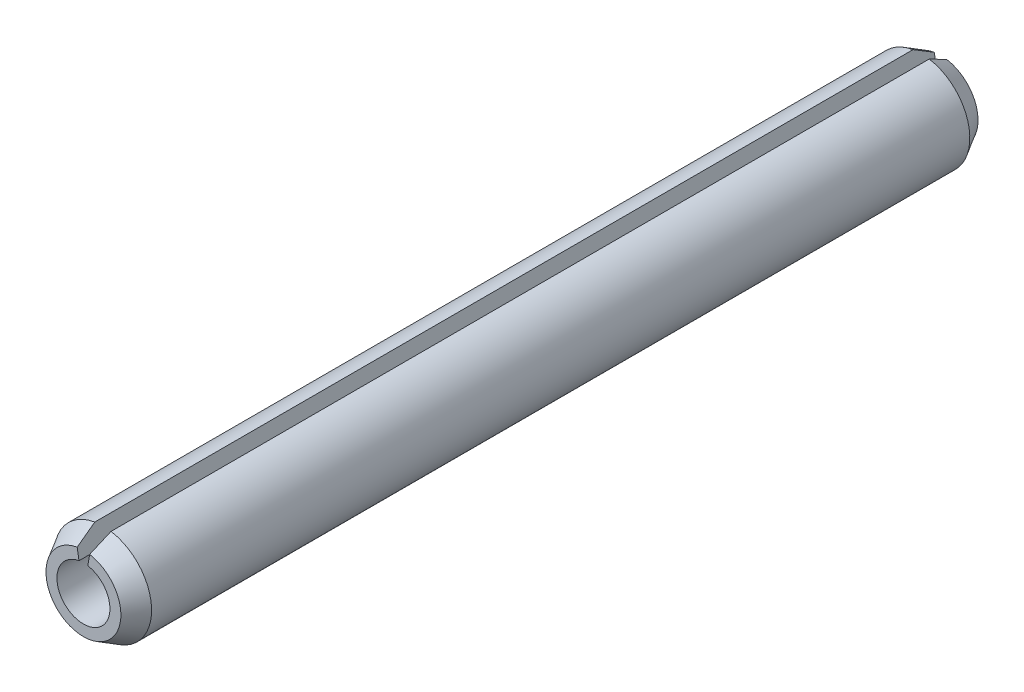
ISO-10303-21;
HEADER;
FILE_DESCRIPTION(('STEP AP214'),'2;1');
FILE_NAME('part.step','',(''),(''),'','','');
FILE_SCHEMA(('AUTOMOTIVE_DESIGN { 1 0 10303 214 1 1 1 1 }'));
ENDSEC;
DATA;
#1=APPLICATION_CONTEXT('core data for automotive mechanical design processes');
#2=APPLICATION_PROTOCOL_DEFINITION('international standard','automotive_design',2000,#1);
#3=PRODUCT_CONTEXT('',#1,'mechanical');
#4=PRODUCT('Part','Part','',(#3));
#5=PRODUCT_RELATED_PRODUCT_CATEGORY('part','',(#4));
#6=PRODUCT_DEFINITION_FORMATION('','',#4);
#7=PRODUCT_DEFINITION_CONTEXT('part definition',#1,'design');
#8=PRODUCT_DEFINITION('design','',#6,#7);
#9=PRODUCT_DEFINITION_SHAPE('','',#8);
#10=(LENGTH_UNIT() NAMED_UNIT(*) SI_UNIT(.MILLI.,.METRE.));
#11=(NAMED_UNIT(*) PLANE_ANGLE_UNIT() SI_UNIT($,.RADIAN.));
#12=(NAMED_UNIT(*) SI_UNIT($,.STERADIAN.) SOLID_ANGLE_UNIT());
#13=UNCERTAINTY_MEASURE_WITH_UNIT(LENGTH_MEASURE(1.E-05),#10,'distance_accuracy_value','');
#14=(GEOMETRIC_REPRESENTATION_CONTEXT(3) GLOBAL_UNCERTAINTY_ASSIGNED_CONTEXT((#13)) GLOBAL_UNIT_ASSIGNED_CONTEXT((#10,
#11,#12)) REPRESENTATION_CONTEXT('',''));
#15=CARTESIAN_POINT('',(0.,0.,0.));
#16=DIRECTION('',(0.,0.,1.));
#17=DIRECTION('',(1.,0.,0.));
#18=AXIS2_PLACEMENT_3D('',#15,#16,#17);
#19=CARTESIAN_POINT('',(0.,0.,11.));
#20=DIRECTION('',(0.,0.,-1.));
#21=DIRECTION('',(-1.,0.,0.));
#22=AXIS2_PLACEMENT_3D('',#19,#20,#21);
#23=CYLINDRICAL_SURFACE('',#22,1.25);
#24=DIRECTION('',(0.,0.,-1.));
#25=VECTOR('',#24,1.);
#26=CARTESIAN_POINT('',(-0.208333333333334,1.23251662147909,11.));
#27=LINE('',#26,#25);
#28=CARTESIAN_POINT('',(-0.208333333333334,1.23251662147909,10.5));
#29=VERTEX_POINT('',#28);
#30=CARTESIAN_POINT('',(-0.208333333333334,1.23251662147909,-10.5));
#31=VERTEX_POINT('',#30);
#32=EDGE_CURVE('E121',#29,#31,#27,.T.);
#33=ORIENTED_EDGE('',*,*,#32,.T.);
#34=CARTESIAN_POINT('',(0.,0.,-10.5));
#35=DIRECTION('',(0.,0.,1.));
#36=DIRECTION('',(1.,0.,0.));
#37=AXIS2_PLACEMENT_3D('',#34,#35,#36);
#38=CIRCLE('',#37,1.25);
#39=CARTESIAN_POINT('',(0.208333333333333,1.23251662147909,-10.5));
#40=VERTEX_POINT('',#39);
#41=EDGE_CURVE('E134',#31,#40,#38,.T.);
#42=ORIENTED_EDGE('',*,*,#41,.T.);
#43=DIRECTION('',(0.,0.,-1.));
#44=VECTOR('',#43,1.);
#45=CARTESIAN_POINT('',(0.208333333333333,1.23251662147909,11.));
#46=LINE('',#45,#44);
#47=CARTESIAN_POINT('',(0.208333333333333,1.23251662147909,10.5));
#48=VERTEX_POINT('',#47);
#49=EDGE_CURVE('E106',#48,#40,#46,.T.);
#50=ORIENTED_EDGE('',*,*,#49,.F.);
#51=CARTESIAN_POINT('',(0.,0.,10.5));
#52=DIRECTION('',(0.,0.,1.));
#53=DIRECTION('',(1.,0.,0.));
#54=AXIS2_PLACEMENT_3D('',#51,#52,#53);
#55=CIRCLE('',#54,1.25);
#56=EDGE_CURVE('E132',#48,#29,#55,.F.);
#57=ORIENTED_EDGE('',*,*,#56,.T.);
#58=EDGE_LOOP('',(#33,#42,#50,#57));
#59=FACE_BOUND('',#58,.T.);
#60=ADVANCED_FACE('F41',(#59),#23,.T.);
#61=CARTESIAN_POINT('',(0.113333333333333,0.670489042084623,11.));
#62=DIRECTION('',(-0.986013297183269,0.166666666666666,0.));
#63=DIRECTION('',(-0.166666666666666,-0.986013297183269,0.));
#64=AXIS2_PLACEMENT_3D('',#61,#62,#63);
#65=PLANE('',#64);
#66=ORIENTED_EDGE('',*,*,#49,.T.);
#67=DIRECTION('',(-0.0833333333333342,-0.493006648591641,-0.866025403784435));
#68=VECTOR('',#67,1.);
#69=CARTESIAN_POINT('',(0.,0.,-12.6650635094611));
#70=LINE('',#69,#68);
#71=CARTESIAN_POINT('',(0.160220810900863,0.947879100202426,-11.));
#72=VERTEX_POINT('',#71);
#73=EDGE_CURVE('E139',#40,#72,#70,.T.);
#74=ORIENTED_EDGE('',*,*,#73,.T.);
#75=DIRECTION('',(0.166666666666666,0.986013297183269,0.));
#76=VECTOR('',#75,1.);
#77=CARTESIAN_POINT('',(0.113333333333333,0.670489042084623,-11.));
#78=LINE('',#77,#76);
#79=CARTESIAN_POINT('',(0.113333333333333,0.670489042084623,-11.));
#80=VERTEX_POINT('',#79);
#81=EDGE_CURVE('E101',#80,#72,#78,.T.);
#82=ORIENTED_EDGE('',*,*,#81,.F.);
#83=DIRECTION('',(0.,0.,-1.));
#84=VECTOR('',#83,1.);
#85=CARTESIAN_POINT('',(0.113333333333333,0.670489042084623,11.));
#86=LINE('',#85,#84);
#87=CARTESIAN_POINT('',(0.113333333333333,0.670489042084623,11.));
#88=VERTEX_POINT('',#87);
#89=EDGE_CURVE('E96',#88,#80,#86,.T.);
#90=ORIENTED_EDGE('',*,*,#89,.F.);
#91=DIRECTION('',(0.166666666666666,0.986013297183269,0.));
#92=VECTOR('',#91,1.);
#93=CARTESIAN_POINT('',(0.113333333333333,0.670489042084623,11.));
#94=LINE('',#93,#92);
#95=CARTESIAN_POINT('',(0.160220810900863,0.947879100202426,11.));
#96=VERTEX_POINT('',#95);
#97=EDGE_CURVE('E100',#88,#96,#94,.T.);
#98=ORIENTED_EDGE('',*,*,#97,.T.);
#99=DIRECTION('',(0.083333333333334,0.49300664859164,-0.866025403784435));
#100=VECTOR('',#99,1.);
#101=CARTESIAN_POINT('',(0.,0.,12.6650635094611));
#102=LINE('',#101,#100);
#103=EDGE_CURVE('E137',#96,#48,#102,.T.);
#104=ORIENTED_EDGE('',*,*,#103,.T.);
#105=EDGE_LOOP('',(#66,#74,#82,#90,#98,#104));
#106=FACE_BOUND('',#105,.T.);
#107=ADVANCED_FACE('F99',(#106),#65,.T.);
#108=CARTESIAN_POINT('',(0.,0.,11.));
#109=DIRECTION('',(0.,0.,-1.));
#110=DIRECTION('',(-1.,0.,0.));
#111=AXIS2_PLACEMENT_3D('',#108,#109,#110);
#112=CYLINDRICAL_SURFACE('',#111,0.68);
#113=CARTESIAN_POINT('',(0.,0.,-11.));
#114=DIRECTION('',(0.,0.,1.));
#115=DIRECTION('',(1.,0.,0.));
#116=AXIS2_PLACEMENT_3D('',#113,#114,#115);
#117=CIRCLE('',#116,0.68);
#118=CARTESIAN_POINT('',(-0.113333333333333,0.670489042084623,-11.));
#119=VERTEX_POINT('',#118);
#120=EDGE_CURVE('E125',#119,#80,#117,.T.);
#121=ORIENTED_EDGE('',*,*,#120,.F.);
#122=DIRECTION('',(0.,0.,-1.));
#123=VECTOR('',#122,1.);
#124=CARTESIAN_POINT('',(-0.113333333333333,0.670489042084623,11.));
#125=LINE('',#124,#123);
#126=CARTESIAN_POINT('',(-0.113333333333333,0.670489042084623,11.));
#127=VERTEX_POINT('',#126);
#128=EDGE_CURVE('E107',#127,#119,#125,.T.);
#129=ORIENTED_EDGE('',*,*,#128,.F.);
#130=CARTESIAN_POINT('',(0.,0.,11.));
#131=DIRECTION('',(0.,0.,1.));
#132=DIRECTION('',(1.,0.,0.));
#133=AXIS2_PLACEMENT_3D('',#130,#131,#132);
#134=CIRCLE('',#133,0.68);
#135=EDGE_CURVE('E112',#127,#88,#134,.T.);
#136=ORIENTED_EDGE('',*,*,#135,.T.);
#137=ORIENTED_EDGE('',*,*,#89,.T.);
#138=EDGE_LOOP('',(#121,#129,#136,#137));
#139=FACE_BOUND('',#138,.T.);
#140=ADVANCED_FACE('F117',(#139),#112,.F.);
#141=CARTESIAN_POINT('',(-0.208333333333334,1.23251662147909,11.));
#142=DIRECTION('',(0.986013297183269,0.166666666666667,0.));
#143=DIRECTION('',(-0.166666666666667,0.986013297183269,0.));
#144=AXIS2_PLACEMENT_3D('',#141,#142,#143);
#145=PLANE('',#144);
#146=DIRECTION('',(0.166666666666667,-0.986013297183269,0.));
#147=VECTOR('',#146,1.);
#148=CARTESIAN_POINT('',(-0.208333333333334,1.23251662147909,-11.));
#149=LINE('',#148,#147);
#150=CARTESIAN_POINT('',(-0.160220810900864,0.947879100202426,-11.));
#151=VERTEX_POINT('',#150);
#152=EDGE_CURVE('E114',#151,#119,#149,.T.);
#153=ORIENTED_EDGE('',*,*,#152,.F.);
#154=DIRECTION('',(-0.0833333333333345,0.493006648591641,0.866025403784435));
#155=VECTOR('',#154,1.);
#156=CARTESIAN_POINT('',(0.,0.,-12.6650635094611));
#157=LINE('',#156,#155);
#158=EDGE_CURVE('E49',#151,#31,#157,.T.);
#159=ORIENTED_EDGE('',*,*,#158,.T.);
#160=ORIENTED_EDGE('',*,*,#32,.F.);
#161=DIRECTION('',(0.0833333333333343,-0.49300664859164,0.866025403784435));
#162=VECTOR('',#161,1.);
#163=CARTESIAN_POINT('',(0.,0.,12.6650635094611));
#164=LINE('',#163,#162);
#165=CARTESIAN_POINT('',(-0.160220810900864,0.947879100202426,11.));
#166=VERTEX_POINT('',#165);
#167=EDGE_CURVE('E56',#29,#166,#164,.T.);
#168=ORIENTED_EDGE('',*,*,#167,.T.);
#169=DIRECTION('',(0.166666666666667,-0.986013297183269,0.));
#170=VECTOR('',#169,1.);
#171=CARTESIAN_POINT('',(-0.208333333333334,1.23251662147909,11.));
#172=LINE('',#171,#170);
#173=EDGE_CURVE('E119',#166,#127,#172,.T.);
#174=ORIENTED_EDGE('',*,*,#173,.T.);
#175=ORIENTED_EDGE('',*,*,#128,.T.);
#176=EDGE_LOOP('',(#153,#159,#160,#168,#174,#175));
#177=FACE_BOUND('',#176,.T.);
#178=ADVANCED_FACE('F143',(#177),#145,.T.);
#179=CARTESIAN_POINT('',(0.,0.,11.));
#180=DIRECTION('',(0.,0.,1.));
#181=DIRECTION('',(1.,0.,0.));
#182=AXIS2_PLACEMENT_3D('',#179,#180,#181);
#183=PLANE('',#182);
#184=ORIENTED_EDGE('',*,*,#173,.F.);
#185=CARTESIAN_POINT('',(0.,0.,11.));
#186=DIRECTION('',(0.,0.,1.));
#187=DIRECTION('',(1.,0.,0.));
#188=AXIS2_PLACEMENT_3D('',#185,#186,#187);
#189=CIRCLE('',#188,0.961324865405182);
#190=EDGE_CURVE('E11',#166,#96,#189,.T.);
#191=ORIENTED_EDGE('',*,*,#190,.T.);
#192=ORIENTED_EDGE('',*,*,#97,.F.);
#193=ORIENTED_EDGE('',*,*,#135,.F.);
#194=EDGE_LOOP('',(#184,#191,#192,#193));
#195=FACE_BOUND('',#194,.T.);
#196=ADVANCED_FACE('F111',(#195),#183,.T.);
#197=CARTESIAN_POINT('',(0.,0.,-11.));
#198=DIRECTION('',(0.,0.,1.));
#199=DIRECTION('',(1.,0.,0.));
#200=AXIS2_PLACEMENT_3D('',#197,#198,#199);
#201=PLANE('',#200);
#202=ORIENTED_EDGE('',*,*,#81,.T.);
#203=CARTESIAN_POINT('',(0.,0.,-11.));
#204=DIRECTION('',(0.,0.,1.));
#205=DIRECTION('',(1.,0.,0.));
#206=AXIS2_PLACEMENT_3D('',#203,#204,#205);
#207=CIRCLE('',#206,0.961324865405182);
#208=EDGE_CURVE('E64',#72,#151,#207,.F.);
#209=ORIENTED_EDGE('',*,*,#208,.T.);
#210=ORIENTED_EDGE('',*,*,#152,.T.);
#211=ORIENTED_EDGE('',*,*,#120,.T.);
#212=EDGE_LOOP('',(#202,#209,#210,#211));
#213=FACE_BOUND('',#212,.T.);
#214=ADVANCED_FACE('F150',(#213),#201,.F.);
#215=CARTESIAN_POINT('',(0.,0.,-10.5));
#216=DIRECTION('',(0.,0.,1.));
#217=DIRECTION('',(1.,0.,0.));
#218=AXIS2_PLACEMENT_3D('',#215,#216,#217);
#219=CONICAL_SURFACE('',#218,1.25,0.523598775598307);
#220=ORIENTED_EDGE('',*,*,#158,.F.);
#221=ORIENTED_EDGE('',*,*,#208,.F.);
#222=ORIENTED_EDGE('',*,*,#73,.F.);
#223=ORIENTED_EDGE('',*,*,#41,.F.);
#224=EDGE_LOOP('',(#220,#221,#222,#223));
#225=FACE_BOUND('',#224,.T.);
#226=ADVANCED_FACE('F149',(#225),#219,.T.);
#227=CARTESIAN_POINT('',(0.,0.,11.));
#228=DIRECTION('',(0.,0.,-1.));
#229=DIRECTION('',(-1.,0.,0.));
#230=AXIS2_PLACEMENT_3D('',#227,#228,#229);
#231=CONICAL_SURFACE('',#230,0.961324865405182,0.523598775598305);
#232=ORIENTED_EDGE('',*,*,#167,.F.);
#233=ORIENTED_EDGE('',*,*,#56,.F.);
#234=ORIENTED_EDGE('',*,*,#103,.F.);
#235=ORIENTED_EDGE('',*,*,#190,.F.);
#236=EDGE_LOOP('',(#232,#233,#234,#235));
#237=FACE_BOUND('',#236,.T.);
#238=ADVANCED_FACE('F43',(#237),#231,.T.);
#239=CLOSED_SHELL('',(#60,#107,#140,#178,#196,#214,#226,#238));
#240=MANIFOLD_SOLID_BREP('B2',#239);
#241=ADVANCED_BREP_SHAPE_REPRESENTATION('',(#18,#240),#14);
#242=SHAPE_DEFINITION_REPRESENTATION(#9,#241);
ENDSEC;
END-ISO-10303-21;
